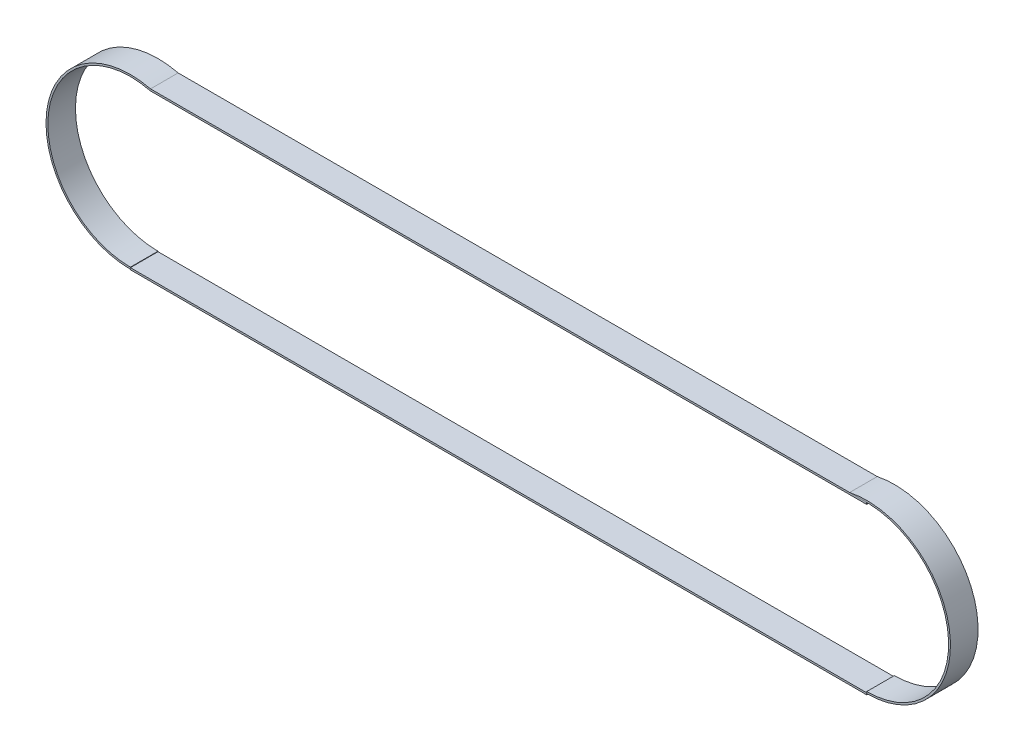
ISO-10303-21;
HEADER;
FILE_DESCRIPTION(('STEP AP214'),'2;1');
FILE_NAME('part.step','',(''),(''),'','','');
FILE_SCHEMA(('AUTOMOTIVE_DESIGN { 1 0 10303 214 1 1 1 1 }'));
ENDSEC;
DATA;
#1=APPLICATION_CONTEXT('core data for automotive mechanical design processes');
#2=APPLICATION_PROTOCOL_DEFINITION('international standard','automotive_design',2000,#1);
#3=PRODUCT_CONTEXT('',#1,'mechanical');
#4=PRODUCT('Part','Part','',(#3));
#5=PRODUCT_RELATED_PRODUCT_CATEGORY('part','',(#4));
#6=PRODUCT_DEFINITION_FORMATION('','',#4);
#7=PRODUCT_DEFINITION_CONTEXT('part definition',#1,'design');
#8=PRODUCT_DEFINITION('design','',#6,#7);
#9=PRODUCT_DEFINITION_SHAPE('','',#8);
#10=(LENGTH_UNIT() NAMED_UNIT(*) SI_UNIT(.MILLI.,.METRE.));
#11=(NAMED_UNIT(*) PLANE_ANGLE_UNIT() SI_UNIT($,.RADIAN.));
#12=(NAMED_UNIT(*) SI_UNIT($,.STERADIAN.) SOLID_ANGLE_UNIT());
#13=UNCERTAINTY_MEASURE_WITH_UNIT(LENGTH_MEASURE(1.E-05),#10,'distance_accuracy_value','');
#14=(GEOMETRIC_REPRESENTATION_CONTEXT(3) GLOBAL_UNCERTAINTY_ASSIGNED_CONTEXT((#13)) GLOBAL_UNIT_ASSIGNED_CONTEXT((#10,
#11,#12)) REPRESENTATION_CONTEXT('',''));
#15=CARTESIAN_POINT('',(0.,0.,0.));
#16=DIRECTION('',(0.,0.,1.));
#17=DIRECTION('',(1.,0.,0.));
#18=AXIS2_PLACEMENT_3D('',#15,#16,#17);
#19=CARTESIAN_POINT('',(3983.27342933872,493.239988456943,150.));
#20=DIRECTION('',(0.,0.,-1.));
#21=DIRECTION('',(-1.,0.,0.));
#22=AXIS2_PLACEMENT_3D('',#19,#20,#21);
#23=CYLINDRICAL_SURFACE('',#22,454.810684724661);
#24=CARTESIAN_POINT('',(3983.27342933872,493.239988456943,0.));
#25=DIRECTION('',(0.,0.,1.));
#26=DIRECTION('',(1.,0.,0.));
#27=AXIS2_PLACEMENT_3D('',#24,#25,#26);
#28=CIRCLE('',#27,454.810684724661);
#29=CARTESIAN_POINT('',(3983.27342933872,38.4293037322822,0.));
#30=VERTEX_POINT('',#29);
#31=CARTESIAN_POINT('',(3888.85577089111,938.142297636144,0.));
#32=VERTEX_POINT('',#31);
#33=EDGE_CURVE('E191',#30,#32,#28,.T.);
#34=ORIENTED_EDGE('',*,*,#33,.T.);
#35=DIRECTION('',(0.,0.,-1.));
#36=VECTOR('',#35,1.);
#37=CARTESIAN_POINT('',(3888.85577089111,938.142297636144,150.));
#38=LINE('',#37,#36);
#39=CARTESIAN_POINT('',(3888.85577089111,938.142297636144,150.));
#40=VERTEX_POINT('',#39);
#41=EDGE_CURVE('E13',#40,#32,#38,.T.);
#42=ORIENTED_EDGE('',*,*,#41,.F.);
#43=CARTESIAN_POINT('',(3983.27342933872,493.239988456943,150.));
#44=DIRECTION('',(0.,0.,1.));
#45=DIRECTION('',(1.,0.,0.));
#46=AXIS2_PLACEMENT_3D('',#43,#44,#45);
#47=CIRCLE('',#46,454.810684724661);
#48=CARTESIAN_POINT('',(3983.27342933872,38.4293037322822,150.));
#49=VERTEX_POINT('',#48);
#50=EDGE_CURVE('E168',#49,#40,#47,.T.);
#51=ORIENTED_EDGE('',*,*,#50,.F.);
#52=DIRECTION('',(0.,0.,-1.));
#53=VECTOR('',#52,1.);
#54=CARTESIAN_POINT('',(3983.27342933872,38.4293037322822,150.));
#55=LINE('',#54,#53);
#56=EDGE_CURVE('E144',#49,#30,#55,.T.);
#57=ORIENTED_EDGE('',*,*,#56,.T.);
#58=EDGE_LOOP('',(#34,#42,#51,#57));
#59=FACE_BOUND('',#58,.T.);
#60=ADVANCED_FACE('F128',(#59),#23,.T.);
#61=CARTESIAN_POINT('',(3890.93174803102,928.360154777109,150.));
#62=DIRECTION('',(-0.978214285903463,-0.207597713991214,0.));
#63=DIRECTION('',(0.207597713991214,-0.978214285903463,0.));
#64=AXIS2_PLACEMENT_3D('',#61,#62,#63);
#65=PLANE('',#64);
#66=DIRECTION('',(-0.207597713991214,0.978214285903463,0.));
#67=VECTOR('',#66,1.);
#68=CARTESIAN_POINT('',(3890.93174803102,928.360154777109,0.));
#69=LINE('',#68,#67);
#70=CARTESIAN_POINT('',(3890.93174803102,928.360154777109,0.));
#71=VERTEX_POINT('',#70);
#72=EDGE_CURVE('E177',#71,#32,#69,.T.);
#73=ORIENTED_EDGE('',*,*,#72,.F.);
#74=DIRECTION('',(0.,0.,-1.));
#75=VECTOR('',#74,1.);
#76=CARTESIAN_POINT('',(3890.93174803102,928.360154777109,150.));
#77=LINE('',#76,#75);
#78=CARTESIAN_POINT('',(3890.93174803102,928.360154777109,150.));
#79=VERTEX_POINT('',#78);
#80=EDGE_CURVE('E136',#79,#71,#77,.T.);
#81=ORIENTED_EDGE('',*,*,#80,.F.);
#82=DIRECTION('',(-0.207597713991214,0.978214285903463,0.));
#83=VECTOR('',#82,1.);
#84=CARTESIAN_POINT('',(3890.93174803102,928.360154777109,150.));
#85=LINE('',#84,#83);
#86=EDGE_CURVE('E175',#79,#40,#85,.T.);
#87=ORIENTED_EDGE('',*,*,#86,.T.);
#88=ORIENTED_EDGE('',*,*,#41,.T.);
#89=EDGE_LOOP('',(#73,#81,#87,#88));
#90=FACE_BOUND('',#89,.T.);
#91=ADVANCED_FACE('F174',(#90),#65,.T.);
#92=CARTESIAN_POINT('',(3983.27342933872,493.239988456943,150.));
#93=DIRECTION('',(0.,0.,-1.));
#94=DIRECTION('',(-1.,0.,0.));
#95=AXIS2_PLACEMENT_3D('',#92,#93,#94);
#96=CYLINDRICAL_SURFACE('',#95,444.810684724661);
#97=CARTESIAN_POINT('',(3983.27342933872,493.239988456943,0.));
#98=DIRECTION('',(0.,0.,1.));
#99=DIRECTION('',(1.,0.,0.));
#100=AXIS2_PLACEMENT_3D('',#97,#98,#99);
#101=CIRCLE('',#100,444.810684724661);
#102=CARTESIAN_POINT('',(3983.27342933872,48.4293037322822,0.));
#103=VERTEX_POINT('',#102);
#104=EDGE_CURVE('E194',#103,#71,#101,.T.);
#105=ORIENTED_EDGE('',*,*,#104,.F.);
#106=DIRECTION('',(0.,0.,-1.));
#107=VECTOR('',#106,1.);
#108=CARTESIAN_POINT('',(3983.27342933872,48.4293037322822,150.));
#109=LINE('',#108,#107);
#110=CARTESIAN_POINT('',(3983.27342933872,48.4293037322822,150.));
#111=VERTEX_POINT('',#110);
#112=EDGE_CURVE('E157',#111,#103,#109,.T.);
#113=ORIENTED_EDGE('',*,*,#112,.F.);
#114=CARTESIAN_POINT('',(3983.27342933872,493.239988456943,150.));
#115=DIRECTION('',(0.,0.,1.));
#116=DIRECTION('',(1.,0.,0.));
#117=AXIS2_PLACEMENT_3D('',#114,#115,#116);
#118=CIRCLE('',#117,444.810684724661);
#119=EDGE_CURVE('E183',#111,#79,#118,.T.);
#120=ORIENTED_EDGE('',*,*,#119,.T.);
#121=ORIENTED_EDGE('',*,*,#80,.T.);
#122=EDGE_LOOP('',(#105,#113,#120,#121));
#123=FACE_BOUND('',#122,.T.);
#124=ADVANCED_FACE('F185',(#123),#96,.F.);
#125=CARTESIAN_POINT('',(3983.27342933872,38.4293037322822,150.));
#126=DIRECTION('',(-1.,0.,0.));
#127=DIRECTION('',(0.,0.,1.));
#128=AXIS2_PLACEMENT_3D('',#125,#126,#127);
#129=PLANE('',#128);
#130=DIRECTION('',(0.,1.,0.));
#131=VECTOR('',#130,1.);
#132=CARTESIAN_POINT('',(3983.27342933872,38.4293037322822,0.));
#133=LINE('',#132,#131);
#134=EDGE_CURVE('E196',#30,#103,#133,.T.);
#135=ORIENTED_EDGE('',*,*,#134,.F.);
#136=ORIENTED_EDGE('',*,*,#56,.F.);
#137=DIRECTION('',(0.,1.,0.));
#138=VECTOR('',#137,1.);
#139=CARTESIAN_POINT('',(3983.27342933872,38.4293037322822,150.));
#140=LINE('',#139,#138);
#141=EDGE_CURVE('E186',#49,#111,#140,.T.);
#142=ORIENTED_EDGE('',*,*,#141,.T.);
#143=ORIENTED_EDGE('',*,*,#112,.T.);
#144=EDGE_LOOP('',(#135,#136,#142,#143));
#145=FACE_BOUND('',#144,.T.);
#146=ADVANCED_FACE('F202',(#145),#129,.T.);
#147=CARTESIAN_POINT('',(3983.27342933872,493.239988456943,150.));
#148=DIRECTION('',(0.,0.,1.));
#149=DIRECTION('',(1.,0.,0.));
#150=AXIS2_PLACEMENT_3D('',#147,#148,#149);
#151=PLANE('',#150);
#152=ORIENTED_EDGE('',*,*,#50,.T.);
#153=ORIENTED_EDGE('',*,*,#86,.F.);
#154=ORIENTED_EDGE('',*,*,#119,.F.);
#155=ORIENTED_EDGE('',*,*,#141,.F.);
#156=EDGE_LOOP('',(#152,#153,#154,#155));
#157=FACE_BOUND('',#156,.T.);
#158=ADVANCED_FACE('F182',(#157),#151,.T.);
#159=CARTESIAN_POINT('',(3983.27342933872,493.239988456943,0.));
#160=DIRECTION('',(0.,0.,1.));
#161=DIRECTION('',(1.,0.,0.));
#162=AXIS2_PLACEMENT_3D('',#159,#160,#161);
#163=PLANE('',#162);
#164=ORIENTED_EDGE('',*,*,#33,.F.);
#165=ORIENTED_EDGE('',*,*,#134,.T.);
#166=ORIENTED_EDGE('',*,*,#104,.T.);
#167=ORIENTED_EDGE('',*,*,#72,.T.);
#168=EDGE_LOOP('',(#164,#165,#166,#167));
#169=FACE_BOUND('',#168,.T.);
#170=ADVANCED_FACE('F201',(#169),#163,.F.);
#171=CLOSED_SHELL('',(#60,#91,#124,#146,#158,#170));
#172=MANIFOLD_SOLID_BREP('B2',#171);
#173=CARTESIAN_POINT('',(-16.726570661278,493.239988456943,150.));
#174=DIRECTION('',(0.,0.,-1.));
#175=DIRECTION('',(-1.,0.,0.));
#176=AXIS2_PLACEMENT_3D('',#173,#174,#175);
#177=CYLINDRICAL_SURFACE('',#176,458.382646829749);
#178=CARTESIAN_POINT('',(-16.726570661278,493.239988456943,0.));
#179=DIRECTION('',(0.,0.,1.));
#180=DIRECTION('',(1.,0.,0.));
#181=AXIS2_PLACEMENT_3D('',#178,#179,#180);
#182=CIRCLE('',#181,458.382646829749);
#183=CARTESIAN_POINT('',(92.7388962666749,938.360154777109,0.));
#184=VERTEX_POINT('',#183);
#185=CARTESIAN_POINT('',(-16.7265706612781,34.8573416271941,0.));
#186=VERTEX_POINT('',#185);
#187=EDGE_CURVE('E342',#184,#186,#182,.T.);
#188=ORIENTED_EDGE('',*,*,#187,.T.);
#189=DIRECTION('',(0.,0.,-1.));
#190=VECTOR('',#189,1.);
#191=CARTESIAN_POINT('',(-16.7265706612781,34.8573416271941,150.));
#192=LINE('',#191,#190);
#193=CARTESIAN_POINT('',(-16.7265706612781,34.8573416271941,150.));
#194=VERTEX_POINT('',#193);
#195=EDGE_CURVE('E126',#194,#186,#192,.T.);
#196=ORIENTED_EDGE('',*,*,#195,.F.);
#197=CARTESIAN_POINT('',(-16.726570661278,493.239988456943,150.));
#198=DIRECTION('',(0.,0.,1.));
#199=DIRECTION('',(1.,0.,0.));
#200=AXIS2_PLACEMENT_3D('',#197,#198,#199);
#201=CIRCLE('',#200,458.382646829749);
#202=CARTESIAN_POINT('',(92.7388962666749,938.360154777109,150.));
#203=VERTEX_POINT('',#202);
#204=EDGE_CURVE('E307',#203,#194,#201,.T.);
#205=ORIENTED_EDGE('',*,*,#204,.F.);
#206=DIRECTION('',(0.,0.,-1.));
#207=VECTOR('',#206,1.);
#208=CARTESIAN_POINT('',(92.7388962666749,938.360154777109,150.));
#209=LINE('',#208,#207);
#210=EDGE_CURVE('E338',#203,#184,#209,.T.);
#211=ORIENTED_EDGE('',*,*,#210,.T.);
#212=EDGE_LOOP('',(#188,#196,#205,#211));
#213=FACE_BOUND('',#212,.T.);
#214=ADVANCED_FACE('F261',(#213),#177,.T.);
#215=CARTESIAN_POINT('',(-16.7265706612781,44.8573416271941,150.));
#216=DIRECTION('',(1.,0.,0.));
#217=DIRECTION('',(0.,0.,-1.));
#218=AXIS2_PLACEMENT_3D('',#215,#216,#217);
#219=PLANE('',#218);
#220=DIRECTION('',(0.,-1.,0.));
#221=VECTOR('',#220,1.);
#222=CARTESIAN_POINT('',(-16.7265706612781,44.8573416271941,0.));
#223=LINE('',#222,#221);
#224=CARTESIAN_POINT('',(-16.7265706612781,44.8573416271941,0.));
#225=VERTEX_POINT('',#224);
#226=EDGE_CURVE('E345',#225,#186,#223,.T.);
#227=ORIENTED_EDGE('',*,*,#226,.F.);
#228=DIRECTION('',(0.,0.,-1.));
#229=VECTOR('',#228,1.);
#230=CARTESIAN_POINT('',(-16.7265706612781,44.8573416271941,150.));
#231=LINE('',#230,#229);
#232=CARTESIAN_POINT('',(-16.7265706612781,44.8573416271941,150.));
#233=VERTEX_POINT('',#232);
#234=EDGE_CURVE('E269',#233,#225,#231,.T.);
#235=ORIENTED_EDGE('',*,*,#234,.F.);
#236=DIRECTION('',(0.,-1.,0.));
#237=VECTOR('',#236,1.);
#238=CARTESIAN_POINT('',(-16.7265706612781,44.8573416271941,150.));
#239=LINE('',#238,#237);
#240=EDGE_CURVE('E431',#233,#194,#239,.T.);
#241=ORIENTED_EDGE('',*,*,#240,.T.);
#242=ORIENTED_EDGE('',*,*,#195,.T.);
#243=EDGE_LOOP('',(#227,#235,#241,#242));
#244=FACE_BOUND('',#243,.T.);
#245=ADVANCED_FACE('F363',(#244),#219,.T.);
#246=CARTESIAN_POINT('',(-16.726570661278,493.239988456943,150.));
#247=DIRECTION('',(0.,0.,-1.));
#248=DIRECTION('',(-1.,0.,0.));
#249=AXIS2_PLACEMENT_3D('',#246,#247,#248);
#250=CYLINDRICAL_SURFACE('',#249,448.382646829749);
#251=CARTESIAN_POINT('',(-16.726570661278,493.239988456943,0.));
#252=DIRECTION('',(0.,0.,1.));
#253=DIRECTION('',(1.,0.,0.));
#254=AXIS2_PLACEMENT_3D('',#251,#252,#253);
#255=CIRCLE('',#254,448.382646829749);
#256=CARTESIAN_POINT('',(91.5205486517232,928.360154777109,0.));
#257=VERTEX_POINT('',#256);
#258=EDGE_CURVE('E348',#257,#225,#255,.T.);
#259=ORIENTED_EDGE('',*,*,#258,.F.);
#260=DIRECTION('',(0.,0.,-1.));
#261=VECTOR('',#260,1.);
#262=CARTESIAN_POINT('',(91.5205486517232,928.360154777109,150.));
#263=LINE('',#262,#261);
#264=CARTESIAN_POINT('',(91.5205486517232,928.360154777109,150.));
#265=VERTEX_POINT('',#264);
#266=EDGE_CURVE('E328',#265,#257,#263,.T.);
#267=ORIENTED_EDGE('',*,*,#266,.F.);
#268=CARTESIAN_POINT('',(-16.726570661278,493.239988456943,150.));
#269=DIRECTION('',(0.,0.,1.));
#270=DIRECTION('',(1.,0.,0.));
#271=AXIS2_PLACEMENT_3D('',#268,#269,#270);
#272=CIRCLE('',#271,448.382646829749);
#273=EDGE_CURVE('E334',#265,#233,#272,.T.);
#274=ORIENTED_EDGE('',*,*,#273,.T.);
#275=ORIENTED_EDGE('',*,*,#234,.T.);
#276=EDGE_LOOP('',(#259,#267,#274,#275));
#277=FACE_BOUND('',#276,.T.);
#278=ADVANCED_FACE('F360',(#277),#250,.F.);
#279=CARTESIAN_POINT('',(3983.27342933872,928.360154777109,150.));
#280=DIRECTION('',(0.,-1.,0.));
#281=DIRECTION('',(0.,0.,-1.));
#282=AXIS2_PLACEMENT_3D('',#279,#280,#281);
#283=PLANE('',#282);
#284=DIRECTION('',(-1.,0.,0.));
#285=VECTOR('',#284,1.);
#286=CARTESIAN_POINT('',(3983.27342933872,928.360154777109,0.));
#287=LINE('',#286,#285);
#288=CARTESIAN_POINT('',(3983.27342933872,928.360154777109,0.));
#289=VERTEX_POINT('',#288);
#290=EDGE_CURVE('E323',#289,#257,#287,.T.);
#291=ORIENTED_EDGE('',*,*,#290,.F.);
#292=DIRECTION('',(0.,0.,-1.));
#293=VECTOR('',#292,1.);
#294=CARTESIAN_POINT('',(3983.27342933872,928.360154777109,150.));
#295=LINE('',#294,#293);
#296=CARTESIAN_POINT('',(3983.27342933872,928.360154777109,150.));
#297=VERTEX_POINT('',#296);
#298=EDGE_CURVE('E318',#297,#289,#295,.T.);
#299=ORIENTED_EDGE('',*,*,#298,.F.);
#300=DIRECTION('',(-1.,0.,0.));
#301=VECTOR('',#300,1.);
#302=CARTESIAN_POINT('',(3983.27342933872,928.360154777109,150.));
#303=LINE('',#302,#301);
#304=EDGE_CURVE('E321',#297,#265,#303,.T.);
#305=ORIENTED_EDGE('',*,*,#304,.T.);
#306=ORIENTED_EDGE('',*,*,#266,.T.);
#307=EDGE_LOOP('',(#291,#299,#305,#306));
#308=FACE_BOUND('',#307,.T.);
#309=ADVANCED_FACE('F320',(#308),#283,.T.);
#310=CARTESIAN_POINT('',(3983.27342933872,938.360154777109,150.));
#311=DIRECTION('',(1.,0.,0.));
#312=DIRECTION('',(0.,0.,-1.));
#313=AXIS2_PLACEMENT_3D('',#310,#311,#312);
#314=PLANE('',#313);
#315=DIRECTION('',(0.,-1.,0.));
#316=VECTOR('',#315,1.);
#317=CARTESIAN_POINT('',(3983.27342933872,938.360154777109,0.));
#318=LINE('',#317,#316);
#319=CARTESIAN_POINT('',(3983.27342933872,938.360154777109,0.));
#320=VERTEX_POINT('',#319);
#321=EDGE_CURVE('E352',#320,#289,#318,.T.);
#322=ORIENTED_EDGE('',*,*,#321,.F.);
#323=DIRECTION('',(0.,0.,-1.));
#324=VECTOR('',#323,1.);
#325=CARTESIAN_POINT('',(3983.27342933872,938.360154777109,150.));
#326=LINE('',#325,#324);
#327=CARTESIAN_POINT('',(3983.27342933872,938.360154777109,150.));
#328=VERTEX_POINT('',#327);
#329=EDGE_CURVE('E298',#328,#320,#326,.T.);
#330=ORIENTED_EDGE('',*,*,#329,.F.);
#331=DIRECTION('',(0.,-1.,0.));
#332=VECTOR('',#331,1.);
#333=CARTESIAN_POINT('',(3983.27342933872,938.360154777109,150.));
#334=LINE('',#333,#332);
#335=EDGE_CURVE('E332',#328,#297,#334,.T.);
#336=ORIENTED_EDGE('',*,*,#335,.T.);
#337=ORIENTED_EDGE('',*,*,#298,.T.);
#338=EDGE_LOOP('',(#322,#330,#336,#337));
#339=FACE_BOUND('',#338,.T.);
#340=ADVANCED_FACE('F336',(#339),#314,.T.);
#341=CARTESIAN_POINT('',(3983.27342933872,938.360154777109,150.));
#342=DIRECTION('',(0.,-1.,0.));
#343=DIRECTION('',(0.,0.,-1.));
#344=AXIS2_PLACEMENT_3D('',#341,#342,#343);
#345=PLANE('',#344);
#346=DIRECTION('',(1.,0.,0.));
#347=VECTOR('',#346,1.);
#348=CARTESIAN_POINT('',(3983.27342933872,938.360154777109,0.));
#349=LINE('',#348,#347);
#350=EDGE_CURVE('E301',#320,#184,#349,.F.);
#351=ORIENTED_EDGE('',*,*,#350,.T.);
#352=ORIENTED_EDGE('',*,*,#210,.F.);
#353=DIRECTION('',(1.,0.,0.));
#354=VECTOR('',#353,1.);
#355=CARTESIAN_POINT('',(3983.27342933872,938.360154777109,150.));
#356=LINE('',#355,#354);
#357=EDGE_CURVE('E277',#328,#203,#356,.F.);
#358=ORIENTED_EDGE('',*,*,#357,.F.);
#359=ORIENTED_EDGE('',*,*,#329,.T.);
#360=EDGE_LOOP('',(#351,#352,#358,#359));
#361=FACE_BOUND('',#360,.T.);
#362=ADVANCED_FACE('F368',(#361),#345,.F.);
#363=CARTESIAN_POINT('',(-16.726570661278,493.239988456943,150.));
#364=DIRECTION('',(0.,0.,1.));
#365=DIRECTION('',(1.,0.,0.));
#366=AXIS2_PLACEMENT_3D('',#363,#364,#365);
#367=PLANE('',#366);
#368=ORIENTED_EDGE('',*,*,#204,.T.);
#369=ORIENTED_EDGE('',*,*,#240,.F.);
#370=ORIENTED_EDGE('',*,*,#273,.F.);
#371=ORIENTED_EDGE('',*,*,#304,.F.);
#372=ORIENTED_EDGE('',*,*,#335,.F.);
#373=ORIENTED_EDGE('',*,*,#357,.T.);
#374=EDGE_LOOP('',(#368,#369,#370,#371,#372,#373));
#375=FACE_BOUND('',#374,.T.);
#376=ADVANCED_FACE('F331',(#375),#367,.T.);
#377=CARTESIAN_POINT('',(-16.726570661278,493.239988456943,0.));
#378=DIRECTION('',(0.,0.,1.));
#379=DIRECTION('',(1.,0.,0.));
#380=AXIS2_PLACEMENT_3D('',#377,#378,#379);
#381=PLANE('',#380);
#382=ORIENTED_EDGE('',*,*,#187,.F.);
#383=ORIENTED_EDGE('',*,*,#350,.F.);
#384=ORIENTED_EDGE('',*,*,#321,.T.);
#385=ORIENTED_EDGE('',*,*,#290,.T.);
#386=ORIENTED_EDGE('',*,*,#258,.T.);
#387=ORIENTED_EDGE('',*,*,#226,.T.);
#388=EDGE_LOOP('',(#382,#383,#384,#385,#386,#387));
#389=FACE_BOUND('',#388,.T.);
#390=ADVANCED_FACE('F366',(#389),#381,.F.);
#391=CLOSED_SHELL('',(#214,#245,#278,#309,#340,#362,#376,#390));
#392=MANIFOLD_SOLID_BREP('B7',#391);
#393=CARTESIAN_POINT('',(-16.726570661278,42.6006420564895,150.));
#394=DIRECTION('',(0.,-1.,0.));
#395=DIRECTION('',(0.,0.,-1.));
#396=AXIS2_PLACEMENT_3D('',#393,#394,#395);
#397=PLANE('',#396);
#398=DIRECTION('',(1.,0.,0.));
#399=VECTOR('',#398,1.);
#400=CARTESIAN_POINT('',(-16.726570661278,42.6006420564895,0.));
#401=LINE('',#400,#399);
#402=CARTESIAN_POINT('',(3983.27342933872,42.6006420564895,0.));
#403=VERTEX_POINT('',#402);
#404=CARTESIAN_POINT('',(-16.726570661278,42.6006420564895,0.));
#405=VERTEX_POINT('',#404);
#406=EDGE_CURVE('E500',#403,#405,#401,.F.);
#407=ORIENTED_EDGE('',*,*,#406,.T.);
#408=DIRECTION('',(0.,0.,-1.));
#409=VECTOR('',#408,1.);
#410=CARTESIAN_POINT('',(-16.726570661278,42.6006420564895,150.));
#411=LINE('',#410,#409);
#412=CARTESIAN_POINT('',(-16.726570661278,42.6006420564895,150.));
#413=VERTEX_POINT('',#412);
#414=EDGE_CURVE('E259',#413,#405,#411,.T.);
#415=ORIENTED_EDGE('',*,*,#414,.F.);
#416=DIRECTION('',(1.,0.,0.));
#417=VECTOR('',#416,1.);
#418=CARTESIAN_POINT('',(-16.726570661278,42.6006420564895,150.));
#419=LINE('',#418,#417);
#420=CARTESIAN_POINT('',(3983.27342933872,42.6006420564895,150.));
#421=VERTEX_POINT('',#420);
#422=EDGE_CURVE('E477',#421,#413,#419,.F.);
#423=ORIENTED_EDGE('',*,*,#422,.F.);
#424=DIRECTION('',(0.,0.,-1.));
#425=VECTOR('',#424,1.);
#426=CARTESIAN_POINT('',(3983.27342933872,42.6006420564895,150.));
#427=LINE('',#426,#425);
#428=EDGE_CURVE('E453',#421,#403,#427,.T.);
#429=ORIENTED_EDGE('',*,*,#428,.T.);
#430=EDGE_LOOP('',(#407,#415,#423,#429));
#431=FACE_BOUND('',#430,.T.);
#432=ADVANCED_FACE('F437',(#431),#397,.F.);
#433=CARTESIAN_POINT('',(-16.726570661278,32.6006420564895,150.));
#434=DIRECTION('',(-1.,0.,0.));
#435=DIRECTION('',(0.,0.,1.));
#436=AXIS2_PLACEMENT_3D('',#433,#434,#435);
#437=PLANE('',#436);
#438=DIRECTION('',(0.,1.,0.));
#439=VECTOR('',#438,1.);
#440=CARTESIAN_POINT('',(-16.726570661278,32.6006420564895,0.));
#441=LINE('',#440,#439);
#442=CARTESIAN_POINT('',(-16.726570661278,32.6006420564895,0.));
#443=VERTEX_POINT('',#442);
#444=EDGE_CURVE('E486',#443,#405,#441,.T.);
#445=ORIENTED_EDGE('',*,*,#444,.F.);
#446=DIRECTION('',(0.,0.,-1.));
#447=VECTOR('',#446,1.);
#448=CARTESIAN_POINT('',(-16.726570661278,32.6006420564895,150.));
#449=LINE('',#448,#447);
#450=CARTESIAN_POINT('',(-16.726570661278,32.6006420564895,150.));
#451=VERTEX_POINT('',#450);
#452=EDGE_CURVE('E445',#451,#443,#449,.T.);
#453=ORIENTED_EDGE('',*,*,#452,.F.);
#454=DIRECTION('',(0.,1.,0.));
#455=VECTOR('',#454,1.);
#456=CARTESIAN_POINT('',(-16.726570661278,32.6006420564895,150.));
#457=LINE('',#456,#455);
#458=EDGE_CURVE('E484',#451,#413,#457,.T.);
#459=ORIENTED_EDGE('',*,*,#458,.T.);
#460=ORIENTED_EDGE('',*,*,#414,.T.);
#461=EDGE_LOOP('',(#445,#453,#459,#460));
#462=FACE_BOUND('',#461,.T.);
#463=ADVANCED_FACE('F483',(#462),#437,.T.);
#464=CARTESIAN_POINT('',(-16.726570661278,32.6006420564895,150.));
#465=DIRECTION('',(0.,-1.,0.));
#466=DIRECTION('',(0.,0.,-1.));
#467=AXIS2_PLACEMENT_3D('',#464,#465,#466);
#468=PLANE('',#467);
#469=DIRECTION('',(-1.,0.,0.));
#470=VECTOR('',#469,1.);
#471=CARTESIAN_POINT('',(-16.726570661278,32.6006420564895,0.));
#472=LINE('',#471,#470);
#473=CARTESIAN_POINT('',(3983.27342933872,32.6006420564895,0.));
#474=VERTEX_POINT('',#473);
#475=EDGE_CURVE('E503',#474,#443,#472,.T.);
#476=ORIENTED_EDGE('',*,*,#475,.F.);
#477=DIRECTION('',(0.,0.,-1.));
#478=VECTOR('',#477,1.);
#479=CARTESIAN_POINT('',(3983.27342933872,32.6006420564895,150.));
#480=LINE('',#479,#478);
#481=CARTESIAN_POINT('',(3983.27342933872,32.6006420564895,150.));
#482=VERTEX_POINT('',#481);
#483=EDGE_CURVE('E466',#482,#474,#480,.T.);
#484=ORIENTED_EDGE('',*,*,#483,.F.);
#485=DIRECTION('',(-1.,0.,0.));
#486=VECTOR('',#485,1.);
#487=CARTESIAN_POINT('',(-16.726570661278,32.6006420564895,150.));
#488=LINE('',#487,#486);
#489=EDGE_CURVE('E492',#482,#451,#488,.T.);
#490=ORIENTED_EDGE('',*,*,#489,.T.);
#491=ORIENTED_EDGE('',*,*,#452,.T.);
#492=EDGE_LOOP('',(#476,#484,#490,#491));
#493=FACE_BOUND('',#492,.T.);
#494=ADVANCED_FACE('F494',(#493),#468,.T.);
#495=CARTESIAN_POINT('',(3983.27342933872,42.6006420564895,150.));
#496=DIRECTION('',(1.,0.,0.));
#497=DIRECTION('',(0.,0.,-1.));
#498=AXIS2_PLACEMENT_3D('',#495,#496,#497);
#499=PLANE('',#498);
#500=DIRECTION('',(0.,-1.,0.));
#501=VECTOR('',#500,1.);
#502=CARTESIAN_POINT('',(3983.27342933872,42.6006420564895,0.));
#503=LINE('',#502,#501);
#504=EDGE_CURVE('E505',#403,#474,#503,.T.);
#505=ORIENTED_EDGE('',*,*,#504,.F.);
#506=ORIENTED_EDGE('',*,*,#428,.F.);
#507=DIRECTION('',(0.,-1.,0.));
#508=VECTOR('',#507,1.);
#509=CARTESIAN_POINT('',(3983.27342933872,42.6006420564895,150.));
#510=LINE('',#509,#508);
#511=EDGE_CURVE('E495',#421,#482,#510,.T.);
#512=ORIENTED_EDGE('',*,*,#511,.T.);
#513=ORIENTED_EDGE('',*,*,#483,.T.);
#514=EDGE_LOOP('',(#505,#506,#512,#513));
#515=FACE_BOUND('',#514,.T.);
#516=ADVANCED_FACE('F511',(#515),#499,.T.);
#517=CARTESIAN_POINT('',(0.,0.,150.));
#518=DIRECTION('',(0.,0.,1.));
#519=DIRECTION('',(1.,0.,0.));
#520=AXIS2_PLACEMENT_3D('',#517,#518,#519);
#521=PLANE('',#520);
#522=ORIENTED_EDGE('',*,*,#422,.T.);
#523=ORIENTED_EDGE('',*,*,#458,.F.);
#524=ORIENTED_EDGE('',*,*,#489,.F.);
#525=ORIENTED_EDGE('',*,*,#511,.F.);
#526=EDGE_LOOP('',(#522,#523,#524,#525));
#527=FACE_BOUND('',#526,.T.);
#528=ADVANCED_FACE('F491',(#527),#521,.T.);
#529=CARTESIAN_POINT('',(0.,0.,0.));
#530=DIRECTION('',(0.,0.,1.));
#531=DIRECTION('',(1.,0.,0.));
#532=AXIS2_PLACEMENT_3D('',#529,#530,#531);
#533=PLANE('',#532);
#534=ORIENTED_EDGE('',*,*,#406,.F.);
#535=ORIENTED_EDGE('',*,*,#504,.T.);
#536=ORIENTED_EDGE('',*,*,#475,.T.);
#537=ORIENTED_EDGE('',*,*,#444,.T.);
#538=EDGE_LOOP('',(#534,#535,#536,#537));
#539=FACE_BOUND('',#538,.T.);
#540=ADVANCED_FACE('F510',(#539),#533,.F.);
#541=CLOSED_SHELL('',(#432,#463,#494,#516,#528,#540));
#542=MANIFOLD_SOLID_BREP('B120',#541);
#543=ADVANCED_BREP_SHAPE_REPRESENTATION('',(#18,#172,#392,#542),#14);
#544=SHAPE_DEFINITION_REPRESENTATION(#9,#543);
ENDSEC;
END-ISO-10303-21;
